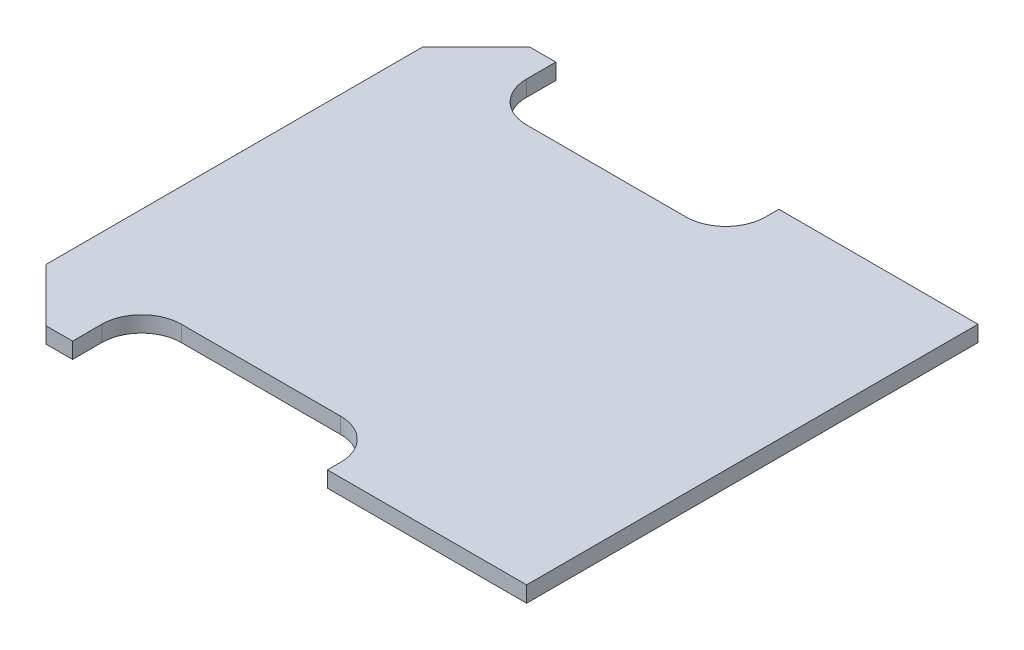
ISO-10303-21;
HEADER;
FILE_DESCRIPTION(('STEP AP214'),'2;1');
FILE_NAME('part.step','',(''),(''),'','','');
FILE_SCHEMA(('AUTOMOTIVE_DESIGN { 1 0 10303 214 1 1 1 1 }'));
ENDSEC;
DATA;
#1=APPLICATION_CONTEXT('core data for automotive mechanical design processes');
#2=APPLICATION_PROTOCOL_DEFINITION('international standard','automotive_design',2000,#1);
#3=PRODUCT_CONTEXT('',#1,'mechanical');
#4=PRODUCT('Part','Part','',(#3));
#5=PRODUCT_RELATED_PRODUCT_CATEGORY('part','',(#4));
#6=PRODUCT_DEFINITION_FORMATION('','',#4);
#7=PRODUCT_DEFINITION_CONTEXT('part definition',#1,'design');
#8=PRODUCT_DEFINITION('design','',#6,#7);
#9=PRODUCT_DEFINITION_SHAPE('','',#8);
#10=(LENGTH_UNIT() NAMED_UNIT(*) SI_UNIT(.MILLI.,.METRE.));
#11=(NAMED_UNIT(*) PLANE_ANGLE_UNIT() SI_UNIT($,.RADIAN.));
#12=(NAMED_UNIT(*) SI_UNIT($,.STERADIAN.) SOLID_ANGLE_UNIT());
#13=UNCERTAINTY_MEASURE_WITH_UNIT(LENGTH_MEASURE(1.E-05),#10,'distance_accuracy_value','');
#14=(GEOMETRIC_REPRESENTATION_CONTEXT(3) GLOBAL_UNCERTAINTY_ASSIGNED_CONTEXT((#13)) GLOBAL_UNIT_ASSIGNED_CONTEXT((#10,
#11,#12)) REPRESENTATION_CONTEXT('',''));
#15=CARTESIAN_POINT('',(0.,0.,0.));
#16=DIRECTION('',(0.,0.,1.));
#17=DIRECTION('',(1.,0.,0.));
#18=AXIS2_PLACEMENT_3D('',#15,#16,#17);
#19=CARTESIAN_POINT('',(82.1666666666667,4.2,75.));
#20=DIRECTION('',(0.,-1.,0.));
#21=DIRECTION('',(0.,0.,-1.));
#22=AXIS2_PLACEMENT_3D('',#19,#20,#21);
#23=CYLINDRICAL_SURFACE('',#22,4.00000000000001);
#24=CARTESIAN_POINT('',(82.1666666666667,0.,75.));
#25=DIRECTION('',(0.,-1.,0.));
#26=DIRECTION('',(0.,0.,1.));
#27=AXIS2_PLACEMENT_3D('',#24,#25,#26);
#28=CIRCLE('',#27,4.00000000000001);
#29=CARTESIAN_POINT('',(82.1666666666667,0.,79.));
#30=VERTEX_POINT('',#29);
#31=EDGE_CURVE('E315',#30,#30,#28,.T.);
#32=ORIENTED_EDGE('',*,*,#31,.T.);
#33=EDGE_LOOP('',(#32));
#34=FACE_BOUND('',#33,.T.);
#35=CARTESIAN_POINT('',(82.1666666666667,1.,75.));
#36=DIRECTION('',(0.,1.,0.));
#37=DIRECTION('',(0.,0.,1.));
#38=AXIS2_PLACEMENT_3D('',#35,#36,#37);
#39=CIRCLE('',#38,4.00000000000001);
#40=CARTESIAN_POINT('',(82.1666666666667,1.,79.));
#41=VERTEX_POINT('',#40);
#42=EDGE_CURVE('E267',#41,#41,#39,.F.);
#43=ORIENTED_EDGE('',*,*,#42,.F.);
#44=EDGE_LOOP('',(#43));
#45=FACE_BOUND('',#44,.T.);
#46=ADVANCED_FACE('F41',(#34,#45),#23,.F.);
#47=CARTESIAN_POINT('',(76.0166666666667,4.2,66.));
#48=DIRECTION('',(0.,0.,1.));
#49=DIRECTION('',(1.,0.,0.));
#50=AXIS2_PLACEMENT_3D('',#47,#48,#49);
#51=PLANE('',#50);
#52=DIRECTION('',(1.,0.,0.));
#53=VECTOR('',#52,1.);
#54=CARTESIAN_POINT('',(76.0166666666667,1.,66.));
#55=LINE('',#54,#53);
#56=CARTESIAN_POINT('',(76.0166666666667,1.,66.));
#57=VERTEX_POINT('',#56);
#58=CARTESIAN_POINT('',(88.3166666666667,1.,66.));
#59=VERTEX_POINT('',#58);
#60=EDGE_CURVE('E287',#57,#59,#55,.T.);
#61=ORIENTED_EDGE('',*,*,#60,.T.);
#62=DIRECTION('',(0.,-1.,0.));
#63=VECTOR('',#62,1.);
#64=CARTESIAN_POINT('',(88.3166666666667,4.2,66.));
#65=LINE('',#64,#63);
#66=CARTESIAN_POINT('',(88.3166666666667,0.,66.));
#67=VERTEX_POINT('',#66);
#68=EDGE_CURVE('E325',#59,#67,#65,.T.);
#69=ORIENTED_EDGE('',*,*,#68,.T.);
#70=DIRECTION('',(-1.,0.,0.));
#71=VECTOR('',#70,1.);
#72=CARTESIAN_POINT('',(76.0166666666667,0.,66.));
#73=LINE('',#72,#71);
#74=CARTESIAN_POINT('',(76.0166666666667,0.,66.));
#75=VERTEX_POINT('',#74);
#76=EDGE_CURVE('E328',#67,#75,#73,.T.);
#77=ORIENTED_EDGE('',*,*,#76,.T.);
#78=DIRECTION('',(0.,-1.,0.));
#79=VECTOR('',#78,1.);
#80=CARTESIAN_POINT('',(76.0166666666667,4.2,66.));
#81=LINE('',#80,#79);
#82=EDGE_CURVE('E294',#57,#75,#81,.T.);
#83=ORIENTED_EDGE('',*,*,#82,.F.);
#84=EDGE_LOOP('',(#61,#69,#77,#83));
#85=FACE_BOUND('',#84,.T.);
#86=ADVANCED_FACE('F578',(#85),#51,.F.);
#87=CARTESIAN_POINT('',(97.5,6.,-85.));
#88=DIRECTION('',(-1.,0.,0.));
#89=DIRECTION('',(0.,0.,1.));
#90=AXIS2_PLACEMENT_3D('',#87,#88,#89);
#91=PLANE('',#90);
#92=DIRECTION('',(0.,0.,-1.));
#93=VECTOR('',#92,1.);
#94=CARTESIAN_POINT('',(97.5,0.,-85.));
#95=LINE('',#94,#93);
#96=CARTESIAN_POINT('',(97.5,0.,85.));
#97=VERTEX_POINT('',#96);
#98=CARTESIAN_POINT('',(97.5,0.,-85.));
#99=VERTEX_POINT('',#98);
#100=EDGE_CURVE('E387',#97,#99,#95,.T.);
#101=ORIENTED_EDGE('',*,*,#100,.T.);
#102=DIRECTION('',(0.,-1.,0.));
#103=VECTOR('',#102,1.);
#104=CARTESIAN_POINT('',(97.5,6.,-85.));
#105=LINE('',#104,#103);
#106=CARTESIAN_POINT('',(97.5,6.,-85.));
#107=VERTEX_POINT('',#106);
#108=EDGE_CURVE('E429',#107,#99,#105,.T.);
#109=ORIENTED_EDGE('',*,*,#108,.F.);
#110=DIRECTION('',(0.,0.,-1.));
#111=VECTOR('',#110,1.);
#112=CARTESIAN_POINT('',(97.5,6.,-85.));
#113=LINE('',#112,#111);
#114=CARTESIAN_POINT('',(97.5,6.,85.));
#115=VERTEX_POINT('',#114);
#116=EDGE_CURVE('E405',#115,#107,#113,.T.);
#117=ORIENTED_EDGE('',*,*,#116,.F.);
#118=DIRECTION('',(0.,-1.,0.));
#119=VECTOR('',#118,1.);
#120=CARTESIAN_POINT('',(97.5,6.,85.));
#121=LINE('',#120,#119);
#122=EDGE_CURVE('E417',#115,#97,#121,.T.);
#123=ORIENTED_EDGE('',*,*,#122,.T.);
#124=EDGE_LOOP('',(#101,#109,#117,#123));
#125=FACE_BOUND('',#124,.T.);
#126=ADVANCED_FACE('F539',(#125),#91,.F.);
#127=CARTESIAN_POINT('',(-97.5,6.,-85.));
#128=DIRECTION('',(0.,0.,1.));
#129=DIRECTION('',(1.,0.,0.));
#130=AXIS2_PLACEMENT_3D('',#127,#128,#129);
#131=PLANE('',#130);
#132=DIRECTION('',(-1.,0.,0.));
#133=VECTOR('',#132,1.);
#134=CARTESIAN_POINT('',(-97.5,0.,-85.));
#135=LINE('',#134,#133);
#136=CARTESIAN_POINT('',(22.5,0.,-85.));
#137=VERTEX_POINT('',#136);
#138=EDGE_CURVE('E420',#99,#137,#135,.T.);
#139=ORIENTED_EDGE('',*,*,#138,.T.);
#140=DIRECTION('',(0.,1.,0.));
#141=VECTOR('',#140,1.);
#142=CARTESIAN_POINT('',(22.5,0.,-85.));
#143=LINE('',#142,#141);
#144=CARTESIAN_POINT('',(22.5,6.,-85.));
#145=VERTEX_POINT('',#144);
#146=EDGE_CURVE('E360',#137,#145,#143,.T.);
#147=ORIENTED_EDGE('',*,*,#146,.T.);
#148=DIRECTION('',(-1.,0.,0.));
#149=VECTOR('',#148,1.);
#150=CARTESIAN_POINT('',(-97.5,6.,-85.));
#151=LINE('',#150,#149);
#152=EDGE_CURVE('E408',#107,#145,#151,.T.);
#153=ORIENTED_EDGE('',*,*,#152,.F.);
#154=ORIENTED_EDGE('',*,*,#108,.T.);
#155=EDGE_LOOP('',(#139,#147,#153,#154));
#156=FACE_BOUND('',#155,.T.);
#157=ADVANCED_FACE('F543',(#156),#131,.F.);
#158=CARTESIAN_POINT('',(-97.5,6.,-85.));
#159=DIRECTION('',(1.,0.,0.));
#160=DIRECTION('',(0.,0.,-1.));
#161=AXIS2_PLACEMENT_3D('',#158,#159,#160);
#162=PLANE('',#161);
#163=DIRECTION('',(0.,0.,1.));
#164=VECTOR('',#163,1.);
#165=CARTESIAN_POINT('',(-97.5,6.,-85.));
#166=LINE('',#165,#164);
#167=CARTESIAN_POINT('',(-97.5,6.,-70.9999999999999));
#168=VERTEX_POINT('',#167);
#169=CARTESIAN_POINT('',(-97.5,6.,71.));
#170=VERTEX_POINT('',#169);
#171=EDGE_CURVE('E412',#168,#170,#166,.T.);
#172=ORIENTED_EDGE('',*,*,#171,.F.);
#173=DIRECTION('',(0.,-1.,0.));
#174=VECTOR('',#173,1.);
#175=CARTESIAN_POINT('',(-97.5,0.,-70.9999999999999));
#176=LINE('',#175,#174);
#177=CARTESIAN_POINT('',(-97.5,0.,-70.9999999999999));
#178=VERTEX_POINT('',#177);
#179=EDGE_CURVE('E478',#168,#178,#176,.T.);
#180=ORIENTED_EDGE('',*,*,#179,.T.);
#181=DIRECTION('',(0.,0.,1.));
#182=VECTOR('',#181,1.);
#183=CARTESIAN_POINT('',(-97.5,0.,-85.));
#184=LINE('',#183,#182);
#185=CARTESIAN_POINT('',(-97.5,0.,71.));
#186=VERTEX_POINT('',#185);
#187=EDGE_CURVE('E423',#178,#186,#184,.T.);
#188=ORIENTED_EDGE('',*,*,#187,.T.);
#189=DIRECTION('',(0.,1.,0.));
#190=VECTOR('',#189,1.);
#191=CARTESIAN_POINT('',(-97.5,6.,71.));
#192=LINE('',#191,#190);
#193=EDGE_CURVE('E475',#186,#170,#192,.T.);
#194=ORIENTED_EDGE('',*,*,#193,.T.);
#195=EDGE_LOOP('',(#172,#180,#188,#194));
#196=FACE_BOUND('',#195,.T.);
#197=ADVANCED_FACE('F499',(#196),#162,.F.);
#198=CARTESIAN_POINT('',(-97.5,6.,85.));
#199=DIRECTION('',(0.,0.,-1.));
#200=DIRECTION('',(-1.,0.,0.));
#201=AXIS2_PLACEMENT_3D('',#198,#199,#200);
#202=PLANE('',#201);
#203=DIRECTION('',(1.,0.,0.));
#204=VECTOR('',#203,1.);
#205=CARTESIAN_POINT('',(-97.5,6.,85.));
#206=LINE('',#205,#204);
#207=CARTESIAN_POINT('',(22.5,6.,85.));
#208=VERTEX_POINT('',#207);
#209=EDGE_CURVE('E415',#208,#115,#206,.T.);
#210=ORIENTED_EDGE('',*,*,#209,.F.);
#211=DIRECTION('',(0.,1.,0.));
#212=VECTOR('',#211,1.);
#213=CARTESIAN_POINT('',(22.5,0.,85.));
#214=LINE('',#213,#212);
#215=CARTESIAN_POINT('',(22.5,0.,85.));
#216=VERTEX_POINT('',#215);
#217=EDGE_CURVE('E376',#216,#208,#214,.T.);
#218=ORIENTED_EDGE('',*,*,#217,.F.);
#219=DIRECTION('',(1.,0.,0.));
#220=VECTOR('',#219,1.);
#221=CARTESIAN_POINT('',(-97.5,0.,85.));
#222=LINE('',#221,#220);
#223=EDGE_CURVE('E409',#216,#97,#222,.T.);
#224=ORIENTED_EDGE('',*,*,#223,.T.);
#225=ORIENTED_EDGE('',*,*,#122,.F.);
#226=EDGE_LOOP('',(#210,#218,#224,#225));
#227=FACE_BOUND('',#226,.T.);
#228=ADVANCED_FACE('F534',(#227),#202,.F.);
#229=CARTESIAN_POINT('',(0.,6.,0.));
#230=DIRECTION('',(0.,1.,0.));
#231=DIRECTION('',(0.,0.,1.));
#232=AXIS2_PLACEMENT_3D('',#229,#230,#231);
#233=PLANE('',#232);
#234=DIRECTION('',(-1.,0.,0.));
#235=VECTOR('',#234,1.);
#236=CARTESIAN_POINT('',(-67.5,6.,-91.));
#237=LINE('',#236,#235);
#238=CARTESIAN_POINT('',(-67.5,6.,-91.));
#239=VERTEX_POINT('',#238);
#240=CARTESIAN_POINT('',(-77.5000000000001,6.,-91.));
#241=VERTEX_POINT('',#240);
#242=EDGE_CURVE('E351',#239,#241,#237,.T.);
#243=ORIENTED_EDGE('',*,*,#242,.T.);
#244=DIRECTION('',(-0.707106781186547,0.,0.707106781186549));
#245=VECTOR('',#244,1.);
#246=CARTESIAN_POINT('',(-84.2500000000001,6.,-84.2499999999999));
#247=LINE('',#246,#245);
#248=EDGE_CURVE('E473',#241,#168,#247,.T.);
#249=ORIENTED_EDGE('',*,*,#248,.T.);
#250=ORIENTED_EDGE('',*,*,#171,.T.);
#251=DIRECTION('',(0.707106781186549,0.,0.707106781186546));
#252=VECTOR('',#251,1.);
#253=CARTESIAN_POINT('',(-84.2499999999998,6.,84.2500000000002));
#254=LINE('',#253,#252);
#255=CARTESIAN_POINT('',(-77.5,6.,91.));
#256=VERTEX_POINT('',#255);
#257=EDGE_CURVE('E471',#170,#256,#254,.T.);
#258=ORIENTED_EDGE('',*,*,#257,.T.);
#259=DIRECTION('',(1.,0.,0.));
#260=VECTOR('',#259,1.);
#261=CARTESIAN_POINT('',(-67.5,6.,91.));
#262=LINE('',#261,#260);
#263=CARTESIAN_POINT('',(-67.5,6.,91.));
#264=VERTEX_POINT('',#263);
#265=EDGE_CURVE('E355',#256,#264,#262,.T.);
#266=ORIENTED_EDGE('',*,*,#265,.T.);
#267=DIRECTION('',(0.,0.,1.));
#268=VECTOR('',#267,1.);
#269=CARTESIAN_POINT('',(-67.5,6.,85.));
#270=LINE('',#269,#268);
#271=CARTESIAN_POINT('',(-67.5,6.,80.));
#272=VERTEX_POINT('',#271);
#273=EDGE_CURVE('E377',#272,#264,#270,.T.);
#274=ORIENTED_EDGE('',*,*,#273,.F.);
#275=CARTESIAN_POINT('',(-52.5,6.,80.));
#276=DIRECTION('',(0.,1.,0.));
#277=DIRECTION('',(0.,0.,1.));
#278=AXIS2_PLACEMENT_3D('',#275,#276,#277);
#279=CIRCLE('',#278,15.);
#280=CARTESIAN_POINT('',(-52.5,6.,65.));
#281=VERTEX_POINT('',#280);
#282=EDGE_CURVE('E460',#272,#281,#279,.F.);
#283=ORIENTED_EDGE('',*,*,#282,.T.);
#284=DIRECTION('',(-1.,0.,0.));
#285=VECTOR('',#284,1.);
#286=CARTESIAN_POINT('',(-67.5,6.,65.));
#287=LINE('',#286,#285);
#288=CARTESIAN_POINT('',(7.49999999999997,6.,65.));
#289=VERTEX_POINT('',#288);
#290=EDGE_CURVE('E370',#289,#281,#287,.T.);
#291=ORIENTED_EDGE('',*,*,#290,.F.);
#292=CARTESIAN_POINT('',(7.49999999999999,6.,80.));
#293=DIRECTION('',(0.,1.,0.));
#294=DIRECTION('',(0.,0.,1.));
#295=AXIS2_PLACEMENT_3D('',#292,#293,#294);
#296=CIRCLE('',#295,15.);
#297=CARTESIAN_POINT('',(22.5,6.,80.));
#298=VERTEX_POINT('',#297);
#299=EDGE_CURVE('E464',#289,#298,#296,.F.);
#300=ORIENTED_EDGE('',*,*,#299,.T.);
#301=DIRECTION('',(0.,0.,-1.));
#302=VECTOR('',#301,1.);
#303=CARTESIAN_POINT('',(22.5,6.,85.));
#304=LINE('',#303,#302);
#305=EDGE_CURVE('E380',#208,#298,#304,.T.);
#306=ORIENTED_EDGE('',*,*,#305,.F.);
#307=ORIENTED_EDGE('',*,*,#209,.T.);
#308=ORIENTED_EDGE('',*,*,#116,.T.);
#309=ORIENTED_EDGE('',*,*,#152,.T.);
#310=DIRECTION('',(0.,0.,-1.));
#311=VECTOR('',#310,1.);
#312=CARTESIAN_POINT('',(22.5,6.,-85.));
#313=LINE('',#312,#311);
#314=CARTESIAN_POINT('',(22.5,6.,-80.));
#315=VERTEX_POINT('',#314);
#316=EDGE_CURVE('E391',#315,#145,#313,.T.);
#317=ORIENTED_EDGE('',*,*,#316,.F.);
#318=CARTESIAN_POINT('',(7.49999999999997,6.,-80.));
#319=DIRECTION('',(0.,1.,0.));
#320=DIRECTION('',(0.,0.,1.));
#321=AXIS2_PLACEMENT_3D('',#318,#319,#320);
#322=CIRCLE('',#321,15.);
#323=CARTESIAN_POINT('',(7.49999999999995,6.,-65.));
#324=VERTEX_POINT('',#323);
#325=EDGE_CURVE('E452',#315,#324,#322,.F.);
#326=ORIENTED_EDGE('',*,*,#325,.T.);
#327=DIRECTION('',(1.,0.,0.));
#328=VECTOR('',#327,1.);
#329=CARTESIAN_POINT('',(-67.5,6.,-64.9999999999999));
#330=LINE('',#329,#328);
#331=CARTESIAN_POINT('',(-52.5,6.,-64.9999999999999));
#332=VERTEX_POINT('',#331);
#333=EDGE_CURVE('E393',#332,#324,#330,.T.);
#334=ORIENTED_EDGE('',*,*,#333,.F.);
#335=CARTESIAN_POINT('',(-52.5,6.,-79.9999999999999));
#336=DIRECTION('',(0.,1.,0.));
#337=DIRECTION('',(0.,0.,1.));
#338=AXIS2_PLACEMENT_3D('',#335,#336,#337);
#339=CIRCLE('',#338,15.);
#340=CARTESIAN_POINT('',(-67.5,6.,-79.9999999999999));
#341=VERTEX_POINT('',#340);
#342=EDGE_CURVE('E456',#332,#341,#339,.F.);
#343=ORIENTED_EDGE('',*,*,#342,.T.);
#344=DIRECTION('',(0.,0.,1.));
#345=VECTOR('',#344,1.);
#346=CARTESIAN_POINT('',(-67.5,6.,-85.));
#347=LINE('',#346,#345);
#348=EDGE_CURVE('E381',#239,#341,#347,.T.);
#349=ORIENTED_EDGE('',*,*,#348,.F.);
#350=EDGE_LOOP('',(#243,#249,#250,#258,#266,#274,#283,#291,#300,#306,#307,#308,#309,#317,#326,
#334,#343,#349));
#351=FACE_BOUND('',#350,.T.);
#352=ADVANCED_FACE('F497',(#351),#233,.T.);
#353=CARTESIAN_POINT('',(0.,0.,0.));
#354=DIRECTION('',(0.,1.,0.));
#355=DIRECTION('',(0.,0.,1.));
#356=AXIS2_PLACEMENT_3D('',#353,#354,#355);
#357=PLANE('',#356);
#358=DIRECTION('',(-1.,0.,0.));
#359=VECTOR('',#358,1.);
#360=CARTESIAN_POINT('',(76.0166666666667,0.,-53.7));
#361=LINE('',#360,#359);
#362=CARTESIAN_POINT('',(88.3166666666667,0.,-53.7));
#363=VERTEX_POINT('',#362);
#364=CARTESIAN_POINT('',(76.0166666666667,0.,-53.7));
#365=VERTEX_POINT('',#364);
#366=EDGE_CURVE('E306',#363,#365,#361,.T.);
#367=ORIENTED_EDGE('',*,*,#366,.F.);
#368=DIRECTION('',(0.,0.,1.));
#369=VECTOR('',#368,1.);
#370=CARTESIAN_POINT('',(88.3166666666667,0.,-53.7));
#371=LINE('',#370,#369);
#372=CARTESIAN_POINT('',(88.3166666666667,0.,-66.));
#373=VERTEX_POINT('',#372);
#374=EDGE_CURVE('E57',#373,#363,#371,.T.);
#375=ORIENTED_EDGE('',*,*,#374,.F.);
#376=DIRECTION('',(1.,0.,0.));
#377=VECTOR('',#376,1.);
#378=CARTESIAN_POINT('',(76.0166666666667,0.,-66.));
#379=LINE('',#378,#377);
#380=CARTESIAN_POINT('',(76.0166666666667,0.,-66.));
#381=VERTEX_POINT('',#380);
#382=EDGE_CURVE('E299',#381,#373,#379,.T.);
#383=ORIENTED_EDGE('',*,*,#382,.F.);
#384=DIRECTION('',(0.,0.,-1.));
#385=VECTOR('',#384,1.);
#386=CARTESIAN_POINT('',(76.0166666666667,0.,-53.7));
#387=LINE('',#386,#385);
#388=EDGE_CURVE('E309',#365,#381,#387,.T.);
#389=ORIENTED_EDGE('',*,*,#388,.F.);
#390=EDGE_LOOP('',(#367,#375,#383,#389));
#391=FACE_BOUND('',#390,.T.);
#392=DIRECTION('',(1.,0.,0.));
#393=VECTOR('',#392,1.);
#394=CARTESIAN_POINT('',(76.0166666666667,0.,53.7));
#395=LINE('',#394,#393);
#396=CARTESIAN_POINT('',(76.0166666666667,0.,53.7));
#397=VERTEX_POINT('',#396);
#398=CARTESIAN_POINT('',(88.3166666666667,0.,53.7));
#399=VERTEX_POINT('',#398);
#400=EDGE_CURVE('E335',#397,#399,#395,.T.);
#401=ORIENTED_EDGE('',*,*,#400,.F.);
#402=DIRECTION('',(0.,0.,-1.));
#403=VECTOR('',#402,1.);
#404=CARTESIAN_POINT('',(76.0166666666667,0.,53.7));
#405=LINE('',#404,#403);
#406=EDGE_CURVE('E65',#75,#397,#405,.T.);
#407=ORIENTED_EDGE('',*,*,#406,.F.);
#408=ORIENTED_EDGE('',*,*,#76,.F.);
#409=DIRECTION('',(0.,0.,1.));
#410=VECTOR('',#409,1.);
#411=CARTESIAN_POINT('',(88.3166666666667,0.,53.7));
#412=LINE('',#411,#410);
#413=EDGE_CURVE('E331',#399,#67,#412,.T.);
#414=ORIENTED_EDGE('',*,*,#413,.F.);
#415=EDGE_LOOP('',(#401,#407,#408,#414));
#416=FACE_BOUND('',#415,.T.);
#417=CARTESIAN_POINT('',(82.1666666666667,0.,-75.));
#418=DIRECTION('',(0.,-1.,0.));
#419=DIRECTION('',(0.,0.,-1.));
#420=AXIS2_PLACEMENT_3D('',#417,#418,#419);
#421=CIRCLE('',#420,4.00000000000001);
#422=CARTESIAN_POINT('',(82.1666666666667,0.,-79.));
#423=VERTEX_POINT('',#422);
#424=EDGE_CURVE('E345',#423,#423,#421,.T.);
#425=ORIENTED_EDGE('',*,*,#424,.F.);
#426=EDGE_LOOP('',(#425));
#427=FACE_BOUND('',#426,.T.);
#428=ORIENTED_EDGE('',*,*,#31,.F.);
#429=EDGE_LOOP('',(#428));
#430=FACE_BOUND('',#429,.T.);
#431=ORIENTED_EDGE('',*,*,#187,.F.);
#432=DIRECTION('',(0.707106781186547,0.,-0.707106781186549));
#433=VECTOR('',#432,1.);
#434=CARTESIAN_POINT('',(-77.5000000000001,0.,-91.));
#435=LINE('',#434,#433);
#436=CARTESIAN_POINT('',(-77.5000000000001,0.,-91.));
#437=VERTEX_POINT('',#436);
#438=EDGE_CURVE('E50',#178,#437,#435,.T.);
#439=ORIENTED_EDGE('',*,*,#438,.T.);
#440=DIRECTION('',(1.,0.,0.));
#441=VECTOR('',#440,1.);
#442=CARTESIAN_POINT('',(-67.5,0.,-91.));
#443=LINE('',#442,#441);
#444=CARTESIAN_POINT('',(-67.5,0.,-91.));
#445=VERTEX_POINT('',#444);
#446=EDGE_CURVE('E358',#437,#445,#443,.T.);
#447=ORIENTED_EDGE('',*,*,#446,.T.);
#448=DIRECTION('',(0.,0.,1.));
#449=VECTOR('',#448,1.);
#450=CARTESIAN_POINT('',(-67.5,0.,-85.));
#451=LINE('',#450,#449);
#452=CARTESIAN_POINT('',(-67.5,0.,-79.9999999999999));
#453=VERTEX_POINT('',#452);
#454=EDGE_CURVE('E394',#445,#453,#451,.T.);
#455=ORIENTED_EDGE('',*,*,#454,.T.);
#456=CARTESIAN_POINT('',(-52.5,0.,-79.9999999999999));
#457=DIRECTION('',(0.,1.,0.));
#458=DIRECTION('',(0.,0.,1.));
#459=AXIS2_PLACEMENT_3D('',#456,#457,#458);
#460=CIRCLE('',#459,15.);
#461=CARTESIAN_POINT('',(-52.5,0.,-64.9999999999999));
#462=VERTEX_POINT('',#461);
#463=EDGE_CURVE('E458',#453,#462,#460,.T.);
#464=ORIENTED_EDGE('',*,*,#463,.T.);
#465=DIRECTION('',(1.,0.,0.));
#466=VECTOR('',#465,1.);
#467=CARTESIAN_POINT('',(-67.5,0.,-64.9999999999999));
#468=LINE('',#467,#466);
#469=CARTESIAN_POINT('',(7.49999999999995,0.,-65.));
#470=VERTEX_POINT('',#469);
#471=EDGE_CURVE('E400',#462,#470,#468,.T.);
#472=ORIENTED_EDGE('',*,*,#471,.T.);
#473=CARTESIAN_POINT('',(7.49999999999997,0.,-80.));
#474=DIRECTION('',(0.,1.,0.));
#475=DIRECTION('',(0.,0.,1.));
#476=AXIS2_PLACEMENT_3D('',#473,#474,#475);
#477=CIRCLE('',#476,15.);
#478=CARTESIAN_POINT('',(22.5,0.,-80.));
#479=VERTEX_POINT('',#478);
#480=EDGE_CURVE('E454',#470,#479,#477,.T.);
#481=ORIENTED_EDGE('',*,*,#480,.T.);
#482=DIRECTION('',(0.,0.,-1.));
#483=VECTOR('',#482,1.);
#484=CARTESIAN_POINT('',(22.5,0.,-85.));
#485=LINE('',#484,#483);
#486=EDGE_CURVE('E390',#479,#137,#485,.T.);
#487=ORIENTED_EDGE('',*,*,#486,.T.);
#488=ORIENTED_EDGE('',*,*,#138,.F.);
#489=ORIENTED_EDGE('',*,*,#100,.F.);
#490=ORIENTED_EDGE('',*,*,#223,.F.);
#491=DIRECTION('',(0.,0.,-1.));
#492=VECTOR('',#491,1.);
#493=CARTESIAN_POINT('',(22.5,0.,85.));
#494=LINE('',#493,#492);
#495=CARTESIAN_POINT('',(22.5,0.,80.));
#496=VERTEX_POINT('',#495);
#497=EDGE_CURVE('E369',#216,#496,#494,.T.);
#498=ORIENTED_EDGE('',*,*,#497,.T.);
#499=CARTESIAN_POINT('',(7.49999999999999,0.,80.));
#500=DIRECTION('',(0.,1.,0.));
#501=DIRECTION('',(0.,0.,1.));
#502=AXIS2_PLACEMENT_3D('',#499,#500,#501);
#503=CIRCLE('',#502,15.);
#504=CARTESIAN_POINT('',(7.49999999999997,0.,65.));
#505=VERTEX_POINT('',#504);
#506=EDGE_CURVE('E466',#496,#505,#503,.T.);
#507=ORIENTED_EDGE('',*,*,#506,.T.);
#508=DIRECTION('',(-1.,0.,0.));
#509=VECTOR('',#508,1.);
#510=CARTESIAN_POINT('',(-67.5,0.,65.));
#511=LINE('',#510,#509);
#512=CARTESIAN_POINT('',(-52.5,0.,65.));
#513=VERTEX_POINT('',#512);
#514=EDGE_CURVE('E373',#505,#513,#511,.T.);
#515=ORIENTED_EDGE('',*,*,#514,.T.);
#516=CARTESIAN_POINT('',(-52.5,0.,80.));
#517=DIRECTION('',(0.,1.,0.));
#518=DIRECTION('',(0.,0.,1.));
#519=AXIS2_PLACEMENT_3D('',#516,#517,#518);
#520=CIRCLE('',#519,15.);
#521=CARTESIAN_POINT('',(-67.5,0.,80.));
#522=VERTEX_POINT('',#521);
#523=EDGE_CURVE('E462',#513,#522,#520,.T.);
#524=ORIENTED_EDGE('',*,*,#523,.T.);
#525=DIRECTION('',(0.,0.,1.));
#526=VECTOR('',#525,1.);
#527=CARTESIAN_POINT('',(-67.5,0.,85.));
#528=LINE('',#527,#526);
#529=CARTESIAN_POINT('',(-67.5,0.,91.));
#530=VERTEX_POINT('',#529);
#531=EDGE_CURVE('E367',#522,#530,#528,.T.);
#532=ORIENTED_EDGE('',*,*,#531,.T.);
#533=DIRECTION('',(-1.,0.,0.));
#534=VECTOR('',#533,1.);
#535=CARTESIAN_POINT('',(-67.5,0.,91.));
#536=LINE('',#535,#534);
#537=CARTESIAN_POINT('',(-77.5,0.,91.));
#538=VERTEX_POINT('',#537);
#539=EDGE_CURVE('E348',#530,#538,#536,.T.);
#540=ORIENTED_EDGE('',*,*,#539,.T.);
#541=DIRECTION('',(-0.707106781186549,0.,-0.707106781186546));
#542=VECTOR('',#541,1.);
#543=CARTESIAN_POINT('',(-97.5,0.,71.));
#544=LINE('',#543,#542);
#545=EDGE_CURVE('E480',#538,#186,#544,.T.);
#546=ORIENTED_EDGE('',*,*,#545,.T.);
#547=EDGE_LOOP('',(#431,#439,#447,#455,#464,#472,#481,#487,#488,#489,#490,#498,#507,#515,#524,
#532,#540,#546));
#548=FACE_BOUND('',#547,.T.);
#549=ADVANCED_FACE('F485',(#391,#416,#427,#430,#548),#357,.F.);
#550=CARTESIAN_POINT('',(-67.5,0.,-85.));
#551=DIRECTION('',(-1.,0.,0.));
#552=DIRECTION('',(0.,0.,1.));
#553=AXIS2_PLACEMENT_3D('',#550,#551,#552);
#554=PLANE('',#553);
#555=ORIENTED_EDGE('',*,*,#348,.T.);
#556=DIRECTION('',(0.,1.,0.));
#557=VECTOR('',#556,1.);
#558=CARTESIAN_POINT('',(-67.5,0.,-79.9999999999999));
#559=LINE('',#558,#557);
#560=EDGE_CURVE('E440',#341,#453,#559,.F.);
#561=ORIENTED_EDGE('',*,*,#560,.T.);
#562=ORIENTED_EDGE('',*,*,#454,.F.);
#563=DIRECTION('',(0.,1.,0.));
#564=VECTOR('',#563,1.);
#565=CARTESIAN_POINT('',(-67.5,-30.5941170815567,-91.));
#566=LINE('',#565,#564);
#567=EDGE_CURVE('E354',#445,#239,#566,.T.);
#568=ORIENTED_EDGE('',*,*,#567,.T.);
#569=EDGE_LOOP('',(#555,#561,#562,#568));
#570=FACE_BOUND('',#569,.T.);
#571=ADVANCED_FACE('F563',(#570),#554,.F.);
#572=CARTESIAN_POINT('',(22.5,0.,-85.));
#573=DIRECTION('',(1.,0.,0.));
#574=DIRECTION('',(0.,0.,-1.));
#575=AXIS2_PLACEMENT_3D('',#572,#573,#574);
#576=PLANE('',#575);
#577=ORIENTED_EDGE('',*,*,#486,.F.);
#578=DIRECTION('',(0.,1.,0.));
#579=VECTOR('',#578,1.);
#580=CARTESIAN_POINT('',(22.5,6.,-80.));
#581=LINE('',#580,#579);
#582=EDGE_CURVE('E432',#479,#315,#581,.T.);
#583=ORIENTED_EDGE('',*,*,#582,.T.);
#584=ORIENTED_EDGE('',*,*,#316,.T.);
#585=ORIENTED_EDGE('',*,*,#146,.F.);
#586=EDGE_LOOP('',(#577,#583,#584,#585));
#587=FACE_BOUND('',#586,.T.);
#588=ADVANCED_FACE('F547',(#587),#576,.F.);
#589=CARTESIAN_POINT('',(-67.5,0.,-64.9999999999999));
#590=DIRECTION('',(0.,0.,1.));
#591=DIRECTION('',(1.,0.,0.));
#592=AXIS2_PLACEMENT_3D('',#589,#590,#591);
#593=PLANE('',#592);
#594=ORIENTED_EDGE('',*,*,#333,.T.);
#595=DIRECTION('',(0.,1.,0.));
#596=VECTOR('',#595,1.);
#597=CARTESIAN_POINT('',(7.49999999999998,0.,-65.));
#598=LINE('',#597,#596);
#599=EDGE_CURVE('E438',#324,#470,#598,.F.);
#600=ORIENTED_EDGE('',*,*,#599,.T.);
#601=ORIENTED_EDGE('',*,*,#471,.F.);
#602=DIRECTION('',(0.,1.,0.));
#603=VECTOR('',#602,1.);
#604=CARTESIAN_POINT('',(-52.5,6.,-64.9999999999999));
#605=LINE('',#604,#603);
#606=EDGE_CURVE('E435',#462,#332,#605,.T.);
#607=ORIENTED_EDGE('',*,*,#606,.T.);
#608=EDGE_LOOP('',(#594,#600,#601,#607));
#609=FACE_BOUND('',#608,.T.);
#610=ADVANCED_FACE('F555',(#609),#593,.F.);
#611=CARTESIAN_POINT('',(-67.5,0.,85.));
#612=DIRECTION('',(-1.,0.,0.));
#613=DIRECTION('',(0.,0.,1.));
#614=AXIS2_PLACEMENT_3D('',#611,#612,#613);
#615=PLANE('',#614);
#616=ORIENTED_EDGE('',*,*,#531,.F.);
#617=DIRECTION('',(0.,1.,0.));
#618=VECTOR('',#617,1.);
#619=CARTESIAN_POINT('',(-67.5,6.,80.));
#620=LINE('',#619,#618);
#621=EDGE_CURVE('E442',#522,#272,#620,.T.);
#622=ORIENTED_EDGE('',*,*,#621,.T.);
#623=ORIENTED_EDGE('',*,*,#273,.T.);
#624=DIRECTION('',(0.,1.,0.));
#625=VECTOR('',#624,1.);
#626=CARTESIAN_POINT('',(-67.5,-30.5941170815567,91.));
#627=LINE('',#626,#625);
#628=EDGE_CURVE('E361',#530,#264,#627,.T.);
#629=ORIENTED_EDGE('',*,*,#628,.F.);
#630=EDGE_LOOP('',(#616,#622,#623,#629));
#631=FACE_BOUND('',#630,.T.);
#632=ADVANCED_FACE('F512',(#631),#615,.F.);
#633=CARTESIAN_POINT('',(-67.5,0.,65.));
#634=DIRECTION('',(0.,0.,-1.));
#635=DIRECTION('',(-1.,0.,0.));
#636=AXIS2_PLACEMENT_3D('',#633,#634,#635);
#637=PLANE('',#636);
#638=ORIENTED_EDGE('',*,*,#290,.T.);
#639=DIRECTION('',(0.,1.,0.));
#640=VECTOR('',#639,1.);
#641=CARTESIAN_POINT('',(-52.5,0.,65.));
#642=LINE('',#641,#640);
#643=EDGE_CURVE('E448',#281,#513,#642,.F.);
#644=ORIENTED_EDGE('',*,*,#643,.T.);
#645=ORIENTED_EDGE('',*,*,#514,.F.);
#646=DIRECTION('',(0.,1.,0.));
#647=VECTOR('',#646,1.);
#648=CARTESIAN_POINT('',(7.49999999999999,6.,65.));
#649=LINE('',#648,#647);
#650=EDGE_CURVE('E445',#505,#289,#649,.T.);
#651=ORIENTED_EDGE('',*,*,#650,.T.);
#652=EDGE_LOOP('',(#638,#644,#645,#651));
#653=FACE_BOUND('',#652,.T.);
#654=ADVANCED_FACE('F518',(#653),#637,.F.);
#655=CARTESIAN_POINT('',(22.5,0.,85.));
#656=DIRECTION('',(1.,0.,0.));
#657=DIRECTION('',(0.,0.,-1.));
#658=AXIS2_PLACEMENT_3D('',#655,#656,#657);
#659=PLANE('',#658);
#660=ORIENTED_EDGE('',*,*,#305,.T.);
#661=DIRECTION('',(0.,1.,0.));
#662=VECTOR('',#661,1.);
#663=CARTESIAN_POINT('',(22.5,0.,80.));
#664=LINE('',#663,#662);
#665=EDGE_CURVE('E450',#298,#496,#664,.F.);
#666=ORIENTED_EDGE('',*,*,#665,.T.);
#667=ORIENTED_EDGE('',*,*,#497,.F.);
#668=ORIENTED_EDGE('',*,*,#217,.T.);
#669=EDGE_LOOP('',(#660,#666,#667,#668));
#670=FACE_BOUND('',#669,.T.);
#671=ADVANCED_FACE('F530',(#670),#659,.F.);
#672=CARTESIAN_POINT('',(7.49999999999997,0.,-80.));
#673=DIRECTION('',(0.,-1.,0.));
#674=DIRECTION('',(0.,0.,-1.));
#675=AXIS2_PLACEMENT_3D('',#672,#673,#674);
#676=CYLINDRICAL_SURFACE('',#675,15.);
#677=ORIENTED_EDGE('',*,*,#480,.F.);
#678=ORIENTED_EDGE('',*,*,#599,.F.);
#679=ORIENTED_EDGE('',*,*,#325,.F.);
#680=ORIENTED_EDGE('',*,*,#582,.F.);
#681=EDGE_LOOP('',(#677,#678,#679,#680));
#682=FACE_BOUND('',#681,.T.);
#683=ADVANCED_FACE('F551',(#682),#676,.F.);
#684=CARTESIAN_POINT('',(-52.5,0.,-79.9999999999999));
#685=DIRECTION('',(0.,-1.,0.));
#686=DIRECTION('',(0.,0.,-1.));
#687=AXIS2_PLACEMENT_3D('',#684,#685,#686);
#688=CYLINDRICAL_SURFACE('',#687,15.);
#689=ORIENTED_EDGE('',*,*,#463,.F.);
#690=ORIENTED_EDGE('',*,*,#560,.F.);
#691=ORIENTED_EDGE('',*,*,#342,.F.);
#692=ORIENTED_EDGE('',*,*,#606,.F.);
#693=EDGE_LOOP('',(#689,#690,#691,#692));
#694=FACE_BOUND('',#693,.T.);
#695=ADVANCED_FACE('F560',(#694),#688,.F.);
#696=CARTESIAN_POINT('',(-52.5,0.,80.));
#697=DIRECTION('',(0.,-1.,0.));
#698=DIRECTION('',(0.,0.,-1.));
#699=AXIS2_PLACEMENT_3D('',#696,#697,#698);
#700=CYLINDRICAL_SURFACE('',#699,15.);
#701=ORIENTED_EDGE('',*,*,#523,.F.);
#702=ORIENTED_EDGE('',*,*,#643,.F.);
#703=ORIENTED_EDGE('',*,*,#282,.F.);
#704=ORIENTED_EDGE('',*,*,#621,.F.);
#705=EDGE_LOOP('',(#701,#702,#703,#704));
#706=FACE_BOUND('',#705,.T.);
#707=ADVANCED_FACE('F522',(#706),#700,.F.);
#708=CARTESIAN_POINT('',(7.49999999999999,0.,80.));
#709=DIRECTION('',(0.,-1.,0.));
#710=DIRECTION('',(0.,0.,-1.));
#711=AXIS2_PLACEMENT_3D('',#708,#709,#710);
#712=CYLINDRICAL_SURFACE('',#711,15.);
#713=ORIENTED_EDGE('',*,*,#506,.F.);
#714=ORIENTED_EDGE('',*,*,#665,.F.);
#715=ORIENTED_EDGE('',*,*,#299,.F.);
#716=ORIENTED_EDGE('',*,*,#650,.F.);
#717=EDGE_LOOP('',(#713,#714,#715,#716));
#718=FACE_BOUND('',#717,.T.);
#719=ADVANCED_FACE('F525',(#718),#712,.F.);
#720=CARTESIAN_POINT('',(-67.5,-30.5941170815567,91.));
#721=DIRECTION('',(0.,0.,1.));
#722=DIRECTION('',(1.,0.,0.));
#723=AXIS2_PLACEMENT_3D('',#720,#721,#722);
#724=PLANE('',#723);
#725=ORIENTED_EDGE('',*,*,#265,.F.);
#726=DIRECTION('',(0.,-1.,0.));
#727=VECTOR('',#726,1.);
#728=CARTESIAN_POINT('',(-77.5,0.,91.));
#729=LINE('',#728,#727);
#730=EDGE_CURVE('E11',#256,#538,#729,.T.);
#731=ORIENTED_EDGE('',*,*,#730,.T.);
#732=ORIENTED_EDGE('',*,*,#539,.F.);
#733=ORIENTED_EDGE('',*,*,#628,.T.);
#734=EDGE_LOOP('',(#725,#731,#732,#733));
#735=FACE_BOUND('',#734,.T.);
#736=ADVANCED_FACE('F507',(#735),#724,.T.);
#737=CARTESIAN_POINT('',(-67.5,-30.5941170815567,-91.));
#738=DIRECTION('',(0.,0.,-1.));
#739=DIRECTION('',(-1.,0.,0.));
#740=AXIS2_PLACEMENT_3D('',#737,#738,#739);
#741=PLANE('',#740);
#742=ORIENTED_EDGE('',*,*,#446,.F.);
#743=DIRECTION('',(0.,1.,0.));
#744=VECTOR('',#743,1.);
#745=CARTESIAN_POINT('',(-77.5000000000001,6.,-91.));
#746=LINE('',#745,#744);
#747=EDGE_CURVE('E468',#437,#241,#746,.T.);
#748=ORIENTED_EDGE('',*,*,#747,.T.);
#749=ORIENTED_EDGE('',*,*,#242,.F.);
#750=ORIENTED_EDGE('',*,*,#567,.F.);
#751=EDGE_LOOP('',(#742,#748,#749,#750));
#752=FACE_BOUND('',#751,.T.);
#753=ADVANCED_FACE('F492',(#752),#741,.T.);
#754=CARTESIAN_POINT('',(-77.5000000000001,-30.5941170815567,-91.));
#755=DIRECTION('',(-0.707106781186548,0.,-0.707106781186546));
#756=DIRECTION('',(0.,-1.,0.));
#757=AXIS2_PLACEMENT_3D('',#754,#755,#756);
#758=PLANE('',#757);
#759=ORIENTED_EDGE('',*,*,#438,.F.);
#760=ORIENTED_EDGE('',*,*,#179,.F.);
#761=ORIENTED_EDGE('',*,*,#248,.F.);
#762=ORIENTED_EDGE('',*,*,#747,.F.);
#763=EDGE_LOOP('',(#759,#760,#761,#762));
#764=FACE_BOUND('',#763,.T.);
#765=ADVANCED_FACE('F494',(#764),#758,.T.);
#766=CARTESIAN_POINT('',(-97.5,6.,71.));
#767=DIRECTION('',(-0.707106781186546,0.,0.707106781186549));
#768=DIRECTION('',(0.,-1.,0.));
#769=AXIS2_PLACEMENT_3D('',#766,#767,#768);
#770=PLANE('',#769);
#771=ORIENTED_EDGE('',*,*,#545,.F.);
#772=ORIENTED_EDGE('',*,*,#730,.F.);
#773=ORIENTED_EDGE('',*,*,#257,.F.);
#774=ORIENTED_EDGE('',*,*,#193,.F.);
#775=EDGE_LOOP('',(#771,#772,#773,#774));
#776=FACE_BOUND('',#775,.T.);
#777=ADVANCED_FACE('F44',(#776),#770,.T.);
#778=CARTESIAN_POINT('',(82.1666666666667,4.2,-75.));
#779=DIRECTION('',(0.,-1.,0.));
#780=DIRECTION('',(0.,0.,-1.));
#781=AXIS2_PLACEMENT_3D('',#778,#779,#780);
#782=CYLINDRICAL_SURFACE('',#781,4.00000000000001);
#783=CARTESIAN_POINT('',(82.1666666666667,1.,-75.));
#784=DIRECTION('',(0.,-1.,0.));
#785=DIRECTION('',(0.,0.,-1.));
#786=AXIS2_PLACEMENT_3D('',#783,#784,#785);
#787=CIRCLE('',#786,4.00000000000001);
#788=CARTESIAN_POINT('',(82.1666666666667,1.,-79.));
#789=VERTEX_POINT('',#788);
#790=EDGE_CURVE('E263',#789,#789,#787,.F.);
#791=ORIENTED_EDGE('',*,*,#790,.T.);
#792=EDGE_LOOP('',(#791));
#793=FACE_BOUND('',#792,.T.);
#794=ORIENTED_EDGE('',*,*,#424,.T.);
#795=EDGE_LOOP('',(#794));
#796=FACE_BOUND('',#795,.T.);
#797=ADVANCED_FACE('F590',(#793,#796),#782,.F.);
#798=CARTESIAN_POINT('',(76.0166666666667,4.2,53.7));
#799=DIRECTION('',(-1.,0.,0.));
#800=DIRECTION('',(0.,0.,1.));
#801=AXIS2_PLACEMENT_3D('',#798,#799,#800);
#802=PLANE('',#801);
#803=ORIENTED_EDGE('',*,*,#406,.T.);
#804=DIRECTION('',(0.,-1.,0.));
#805=VECTOR('',#804,1.);
#806=CARTESIAN_POINT('',(76.0166666666667,4.2,53.7));
#807=LINE('',#806,#805);
#808=CARTESIAN_POINT('',(76.0166666666667,4.2,53.7));
#809=VERTEX_POINT('',#808);
#810=EDGE_CURVE('E320',#809,#397,#807,.T.);
#811=ORIENTED_EDGE('',*,*,#810,.F.);
#812=DIRECTION('',(0.,0.,-1.));
#813=VECTOR('',#812,1.);
#814=CARTESIAN_POINT('',(76.0166666666667,4.2,53.7));
#815=LINE('',#814,#813);
#816=CARTESIAN_POINT('',(76.0166666666667,4.2,81.15));
#817=VERTEX_POINT('',#816);
#818=EDGE_CURVE('E332',#817,#809,#815,.T.);
#819=ORIENTED_EDGE('',*,*,#818,.F.);
#820=DIRECTION('',(0.,1.,0.));
#821=VECTOR('',#820,1.);
#822=CARTESIAN_POINT('',(76.0166666666667,1.,81.15));
#823=LINE('',#822,#821);
#824=CARTESIAN_POINT('',(76.0166666666667,1.,81.15));
#825=VERTEX_POINT('',#824);
#826=EDGE_CURVE('E276',#825,#817,#823,.T.);
#827=ORIENTED_EDGE('',*,*,#826,.F.);
#828=DIRECTION('',(0.,0.,-1.));
#829=VECTOR('',#828,1.);
#830=CARTESIAN_POINT('',(76.0166666666667,1.,66.));
#831=LINE('',#830,#829);
#832=EDGE_CURVE('E283',#825,#57,#831,.T.);
#833=ORIENTED_EDGE('',*,*,#832,.T.);
#834=ORIENTED_EDGE('',*,*,#82,.T.);
#835=EDGE_LOOP('',(#803,#811,#819,#827,#833,#834));
#836=FACE_BOUND('',#835,.T.);
#837=ADVANCED_FACE('F636',(#836),#802,.F.);
#838=CARTESIAN_POINT('',(88.3166666666667,4.2,53.7));
#839=DIRECTION('',(1.,0.,0.));
#840=DIRECTION('',(0.,0.,-1.));
#841=AXIS2_PLACEMENT_3D('',#838,#839,#840);
#842=PLANE('',#841);
#843=ORIENTED_EDGE('',*,*,#413,.T.);
#844=ORIENTED_EDGE('',*,*,#68,.F.);
#845=DIRECTION('',(0.,0.,1.));
#846=VECTOR('',#845,1.);
#847=CARTESIAN_POINT('',(88.3166666666667,1.,66.));
#848=LINE('',#847,#846);
#849=CARTESIAN_POINT('',(88.3166666666667,1.,81.15));
#850=VERTEX_POINT('',#849);
#851=EDGE_CURVE('E285',#59,#850,#848,.T.);
#852=ORIENTED_EDGE('',*,*,#851,.T.);
#853=DIRECTION('',(0.,1.,0.));
#854=VECTOR('',#853,1.);
#855=CARTESIAN_POINT('',(88.3166666666667,1.,81.15));
#856=LINE('',#855,#854);
#857=CARTESIAN_POINT('',(88.3166666666667,4.2,81.15));
#858=VERTEX_POINT('',#857);
#859=EDGE_CURVE('E273',#850,#858,#856,.T.);
#860=ORIENTED_EDGE('',*,*,#859,.T.);
#861=DIRECTION('',(0.,0.,1.));
#862=VECTOR('',#861,1.);
#863=CARTESIAN_POINT('',(88.3166666666667,4.2,53.7));
#864=LINE('',#863,#862);
#865=CARTESIAN_POINT('',(88.3166666666667,4.2,53.7));
#866=VERTEX_POINT('',#865);
#867=EDGE_CURVE('E322',#866,#858,#864,.T.);
#868=ORIENTED_EDGE('',*,*,#867,.F.);
#869=DIRECTION('',(0.,-1.,0.));
#870=VECTOR('',#869,1.);
#871=CARTESIAN_POINT('',(88.3166666666667,4.2,53.7));
#872=LINE('',#871,#870);
#873=EDGE_CURVE('E323',#866,#399,#872,.T.);
#874=ORIENTED_EDGE('',*,*,#873,.T.);
#875=EDGE_LOOP('',(#843,#844,#852,#860,#868,#874));
#876=FACE_BOUND('',#875,.T.);
#877=ADVANCED_FACE('F641',(#876),#842,.F.);
#878=CARTESIAN_POINT('',(76.0166666666667,4.2,53.7));
#879=DIRECTION('',(0.,0.,-1.));
#880=DIRECTION('',(-1.,0.,0.));
#881=AXIS2_PLACEMENT_3D('',#878,#879,#880);
#882=PLANE('',#881);
#883=ORIENTED_EDGE('',*,*,#400,.T.);
#884=ORIENTED_EDGE('',*,*,#873,.F.);
#885=DIRECTION('',(1.,0.,0.));
#886=VECTOR('',#885,1.);
#887=CARTESIAN_POINT('',(76.0166666666667,4.2,53.7));
#888=LINE('',#887,#886);
#889=EDGE_CURVE('E340',#809,#866,#888,.T.);
#890=ORIENTED_EDGE('',*,*,#889,.F.);
#891=ORIENTED_EDGE('',*,*,#810,.T.);
#892=EDGE_LOOP('',(#883,#884,#890,#891));
#893=FACE_BOUND('',#892,.T.);
#894=ADVANCED_FACE('F675',(#893),#882,.F.);
#895=CARTESIAN_POINT('',(88.3166666666667,4.2,-53.7));
#896=DIRECTION('',(1.,0.,0.));
#897=DIRECTION('',(0.,0.,-1.));
#898=AXIS2_PLACEMENT_3D('',#895,#896,#897);
#899=PLANE('',#898);
#900=ORIENTED_EDGE('',*,*,#374,.T.);
#901=DIRECTION('',(0.,-1.,0.));
#902=VECTOR('',#901,1.);
#903=CARTESIAN_POINT('',(88.3166666666667,4.2,-53.7));
#904=LINE('',#903,#902);
#905=CARTESIAN_POINT('',(88.3166666666667,4.2,-53.7));
#906=VERTEX_POINT('',#905);
#907=EDGE_CURVE('E304',#906,#363,#904,.T.);
#908=ORIENTED_EDGE('',*,*,#907,.F.);
#909=DIRECTION('',(0.,0.,1.));
#910=VECTOR('',#909,1.);
#911=CARTESIAN_POINT('',(88.3166666666667,4.2,-53.7));
#912=LINE('',#911,#910);
#913=CARTESIAN_POINT('',(88.3166666666667,4.2,-81.15));
#914=VERTEX_POINT('',#913);
#915=EDGE_CURVE('E295',#914,#906,#912,.T.);
#916=ORIENTED_EDGE('',*,*,#915,.F.);
#917=DIRECTION('',(0.,1.,0.));
#918=VECTOR('',#917,1.);
#919=CARTESIAN_POINT('',(88.3166666666667,1.,-81.15));
#920=LINE('',#919,#918);
#921=CARTESIAN_POINT('',(88.3166666666667,1.,-81.15));
#922=VERTEX_POINT('',#921);
#923=EDGE_CURVE('E264',#922,#914,#920,.T.);
#924=ORIENTED_EDGE('',*,*,#923,.F.);
#925=DIRECTION('',(0.,0.,1.));
#926=VECTOR('',#925,1.);
#927=CARTESIAN_POINT('',(88.3166666666667,1.,-66.));
#928=LINE('',#927,#926);
#929=CARTESIAN_POINT('',(88.3166666666667,1.,-66.));
#930=VERTEX_POINT('',#929);
#931=EDGE_CURVE('E244',#922,#930,#928,.T.);
#932=ORIENTED_EDGE('',*,*,#931,.T.);
#933=DIRECTION('',(0.,-1.,0.));
#934=VECTOR('',#933,1.);
#935=CARTESIAN_POINT('',(88.3166666666667,4.2,-66.));
#936=LINE('',#935,#934);
#937=EDGE_CURVE('E313',#930,#373,#936,.T.);
#938=ORIENTED_EDGE('',*,*,#937,.T.);
#939=EDGE_LOOP('',(#900,#908,#916,#924,#932,#938));
#940=FACE_BOUND('',#939,.T.);
#941=ADVANCED_FACE('F671',(#940),#899,.F.);
#942=CARTESIAN_POINT('',(76.0166666666667,4.2,-66.));
#943=DIRECTION('',(0.,0.,-1.));
#944=DIRECTION('',(-1.,0.,0.));
#945=AXIS2_PLACEMENT_3D('',#942,#943,#944);
#946=PLANE('',#945);
#947=ORIENTED_EDGE('',*,*,#937,.F.);
#948=DIRECTION('',(-1.,0.,0.));
#949=VECTOR('',#948,1.);
#950=CARTESIAN_POINT('',(76.0166666666667,1.,-66.));
#951=LINE('',#950,#949);
#952=CARTESIAN_POINT('',(76.0166666666667,1.,-66.));
#953=VERTEX_POINT('',#952);
#954=EDGE_CURVE('E269',#930,#953,#951,.T.);
#955=ORIENTED_EDGE('',*,*,#954,.T.);
#956=DIRECTION('',(0.,-1.,0.));
#957=VECTOR('',#956,1.);
#958=CARTESIAN_POINT('',(76.0166666666667,4.2,-66.));
#959=LINE('',#958,#957);
#960=EDGE_CURVE('E257',#953,#381,#959,.T.);
#961=ORIENTED_EDGE('',*,*,#960,.T.);
#962=ORIENTED_EDGE('',*,*,#382,.T.);
#963=EDGE_LOOP('',(#947,#955,#961,#962));
#964=FACE_BOUND('',#963,.T.);
#965=ADVANCED_FACE('F668',(#964),#946,.F.);
#966=CARTESIAN_POINT('',(76.0166666666667,4.2,-53.7));
#967=DIRECTION('',(-1.,0.,0.));
#968=DIRECTION('',(0.,0.,1.));
#969=AXIS2_PLACEMENT_3D('',#966,#967,#968);
#970=PLANE('',#969);
#971=ORIENTED_EDGE('',*,*,#388,.T.);
#972=ORIENTED_EDGE('',*,*,#960,.F.);
#973=DIRECTION('',(0.,0.,-1.));
#974=VECTOR('',#973,1.);
#975=CARTESIAN_POINT('',(76.0166666666667,1.,-66.));
#976=LINE('',#975,#974);
#977=CARTESIAN_POINT('',(76.0166666666667,1.,-81.15));
#978=VERTEX_POINT('',#977);
#979=EDGE_CURVE('E242',#953,#978,#976,.T.);
#980=ORIENTED_EDGE('',*,*,#979,.T.);
#981=DIRECTION('',(0.,1.,0.));
#982=VECTOR('',#981,1.);
#983=CARTESIAN_POINT('',(76.0166666666667,1.,-81.15));
#984=LINE('',#983,#982);
#985=CARTESIAN_POINT('',(76.0166666666667,4.2,-81.15));
#986=VERTEX_POINT('',#985);
#987=EDGE_CURVE('E256',#978,#986,#984,.T.);
#988=ORIENTED_EDGE('',*,*,#987,.T.);
#989=DIRECTION('',(0.,0.,-1.));
#990=VECTOR('',#989,1.);
#991=CARTESIAN_POINT('',(76.0166666666667,4.2,-53.7));
#992=LINE('',#991,#990);
#993=CARTESIAN_POINT('',(76.0166666666667,4.2,-53.7));
#994=VERTEX_POINT('',#993);
#995=EDGE_CURVE('E302',#994,#986,#992,.T.);
#996=ORIENTED_EDGE('',*,*,#995,.F.);
#997=DIRECTION('',(0.,-1.,0.));
#998=VECTOR('',#997,1.);
#999=CARTESIAN_POINT('',(76.0166666666667,4.2,-53.7));
#1000=LINE('',#999,#998);
#1001=EDGE_CURVE('E317',#994,#365,#1000,.T.);
#1002=ORIENTED_EDGE('',*,*,#1001,.T.);
#1003=EDGE_LOOP('',(#971,#972,#980,#988,#996,#1002));
#1004=FACE_BOUND('',#1003,.T.);
#1005=ADVANCED_FACE('F254',(#1004),#970,.F.);
#1006=CARTESIAN_POINT('',(76.0166666666667,4.2,-53.7));
#1007=DIRECTION('',(0.,0.,1.));
#1008=DIRECTION('',(1.,0.,0.));
#1009=AXIS2_PLACEMENT_3D('',#1006,#1007,#1008);
#1010=PLANE('',#1009);
#1011=ORIENTED_EDGE('',*,*,#366,.T.);
#1012=ORIENTED_EDGE('',*,*,#1001,.F.);
#1013=DIRECTION('',(-1.,0.,0.));
#1014=VECTOR('',#1013,1.);
#1015=CARTESIAN_POINT('',(76.0166666666667,4.2,-53.7));
#1016=LINE('',#1015,#1014);
#1017=EDGE_CURVE('E298',#906,#994,#1016,.T.);
#1018=ORIENTED_EDGE('',*,*,#1017,.F.);
#1019=ORIENTED_EDGE('',*,*,#907,.T.);
#1020=EDGE_LOOP('',(#1011,#1012,#1018,#1019));
#1021=FACE_BOUND('',#1020,.T.);
#1022=ADVANCED_FACE('F650',(#1021),#1010,.F.);
#1023=CARTESIAN_POINT('',(0.,1.,0.));
#1024=DIRECTION('',(0.,-1.,0.));
#1025=DIRECTION('',(0.,0.,-1.));
#1026=AXIS2_PLACEMENT_3D('',#1023,#1024,#1025);
#1027=PLANE('',#1026);
#1028=ORIENTED_EDGE('',*,*,#979,.F.);
#1029=ORIENTED_EDGE('',*,*,#954,.F.);
#1030=ORIENTED_EDGE('',*,*,#931,.F.);
#1031=DIRECTION('',(1.,0.,0.));
#1032=VECTOR('',#1031,1.);
#1033=CARTESIAN_POINT('',(76.0166666666667,1.,-81.15));
#1034=LINE('',#1033,#1032);
#1035=EDGE_CURVE('E237',#978,#922,#1034,.T.);
#1036=ORIENTED_EDGE('',*,*,#1035,.F.);
#1037=EDGE_LOOP('',(#1028,#1029,#1030,#1036));
#1038=FACE_BOUND('',#1037,.T.);
#1039=ORIENTED_EDGE('',*,*,#790,.F.);
#1040=EDGE_LOOP('',(#1039));
#1041=FACE_BOUND('',#1040,.T.);
#1042=ADVANCED_FACE('F239',(#1038,#1041),#1027,.F.);
#1043=CARTESIAN_POINT('',(76.0166666666667,1.,-81.15));
#1044=DIRECTION('',(0.,0.,1.));
#1045=DIRECTION('',(1.,0.,0.));
#1046=AXIS2_PLACEMENT_3D('',#1043,#1044,#1045);
#1047=PLANE('',#1046);
#1048=DIRECTION('',(1.,0.,0.));
#1049=VECTOR('',#1048,1.);
#1050=CARTESIAN_POINT('',(76.0166666666667,4.2,-81.15));
#1051=LINE('',#1050,#1049);
#1052=EDGE_CURVE('E258',#986,#914,#1051,.T.);
#1053=ORIENTED_EDGE('',*,*,#1052,.F.);
#1054=ORIENTED_EDGE('',*,*,#987,.F.);
#1055=ORIENTED_EDGE('',*,*,#1035,.T.);
#1056=ORIENTED_EDGE('',*,*,#923,.T.);
#1057=EDGE_LOOP('',(#1053,#1054,#1055,#1056));
#1058=FACE_BOUND('',#1057,.T.);
#1059=ADVANCED_FACE('F261',(#1058),#1047,.T.);
#1060=CARTESIAN_POINT('',(0.,1.,0.));
#1061=DIRECTION('',(0.,1.,0.));
#1062=DIRECTION('',(0.,0.,1.));
#1063=AXIS2_PLACEMENT_3D('',#1060,#1061,#1062);
#1064=PLANE('',#1063);
#1065=ORIENTED_EDGE('',*,*,#832,.F.);
#1066=DIRECTION('',(-1.,0.,0.));
#1067=VECTOR('',#1066,1.);
#1068=CARTESIAN_POINT('',(76.0166666666667,1.,81.15));
#1069=LINE('',#1068,#1067);
#1070=EDGE_CURVE('E279',#850,#825,#1069,.T.);
#1071=ORIENTED_EDGE('',*,*,#1070,.F.);
#1072=ORIENTED_EDGE('',*,*,#851,.F.);
#1073=ORIENTED_EDGE('',*,*,#60,.F.);
#1074=EDGE_LOOP('',(#1065,#1071,#1072,#1073));
#1075=FACE_BOUND('',#1074,.T.);
#1076=ORIENTED_EDGE('',*,*,#42,.T.);
#1077=EDGE_LOOP('',(#1076));
#1078=FACE_BOUND('',#1077,.T.);
#1079=ADVANCED_FACE('F656',(#1075,#1078),#1064,.T.);
#1080=CARTESIAN_POINT('',(76.0166666666667,1.,81.15));
#1081=DIRECTION('',(0.,0.,-1.));
#1082=DIRECTION('',(-1.,0.,0.));
#1083=AXIS2_PLACEMENT_3D('',#1080,#1081,#1082);
#1084=PLANE('',#1083);
#1085=DIRECTION('',(-1.,0.,0.));
#1086=VECTOR('',#1085,1.);
#1087=CARTESIAN_POINT('',(76.0166666666667,4.2,81.15));
#1088=LINE('',#1087,#1086);
#1089=EDGE_CURVE('E280',#858,#817,#1088,.T.);
#1090=ORIENTED_EDGE('',*,*,#1089,.F.);
#1091=ORIENTED_EDGE('',*,*,#859,.F.);
#1092=ORIENTED_EDGE('',*,*,#1070,.T.);
#1093=ORIENTED_EDGE('',*,*,#826,.T.);
#1094=EDGE_LOOP('',(#1090,#1091,#1092,#1093));
#1095=FACE_BOUND('',#1094,.T.);
#1096=ADVANCED_FACE('F661',(#1095),#1084,.T.);
#1097=CARTESIAN_POINT('',(82.1666666666667,4.2,-75.));
#1098=DIRECTION('',(0.,-1.,0.));
#1099=DIRECTION('',(0.,0.,-1.));
#1100=AXIS2_PLACEMENT_3D('',#1097,#1098,#1099);
#1101=PLANE('',#1100);
#1102=ORIENTED_EDGE('',*,*,#915,.T.);
#1103=ORIENTED_EDGE('',*,*,#1017,.T.);
#1104=ORIENTED_EDGE('',*,*,#995,.T.);
#1105=ORIENTED_EDGE('',*,*,#1052,.T.);
#1106=EDGE_LOOP('',(#1102,#1103,#1104,#1105));
#1107=FACE_BOUND('',#1106,.T.);
#1108=ADVANCED_FACE('F595',(#1107),#1101,.T.);
#1109=CARTESIAN_POINT('',(82.1666666666667,4.2,75.));
#1110=DIRECTION('',(0.,1.,0.));
#1111=DIRECTION('',(0.,0.,1.));
#1112=AXIS2_PLACEMENT_3D('',#1109,#1110,#1111);
#1113=PLANE('',#1112);
#1114=ORIENTED_EDGE('',*,*,#818,.T.);
#1115=ORIENTED_EDGE('',*,*,#889,.T.);
#1116=ORIENTED_EDGE('',*,*,#867,.T.);
#1117=ORIENTED_EDGE('',*,*,#1089,.T.);
#1118=EDGE_LOOP('',(#1114,#1115,#1116,#1117));
#1119=FACE_BOUND('',#1118,.T.);
#1120=ADVANCED_FACE('F592',(#1119),#1113,.F.);
#1121=CLOSED_SHELL('',(#46,#86,#126,#157,#197,#228,#352,#549,#571,#588,#610,#632,#654,#671,#683,
#695,#707,#719,#736,#753,#765,#777,#797,#837,#877,#894,#941,#965,#1005,#1022,#1042,#1059,#1079,
#1096,#1108,#1120));
#1122=MANIFOLD_SOLID_BREP('B2',#1121);
#1123=ADVANCED_BREP_SHAPE_REPRESENTATION('',(#18,#1122),#14);
#1124=SHAPE_DEFINITION_REPRESENTATION(#9,#1123);
ENDSEC;
END-ISO-10303-21;
